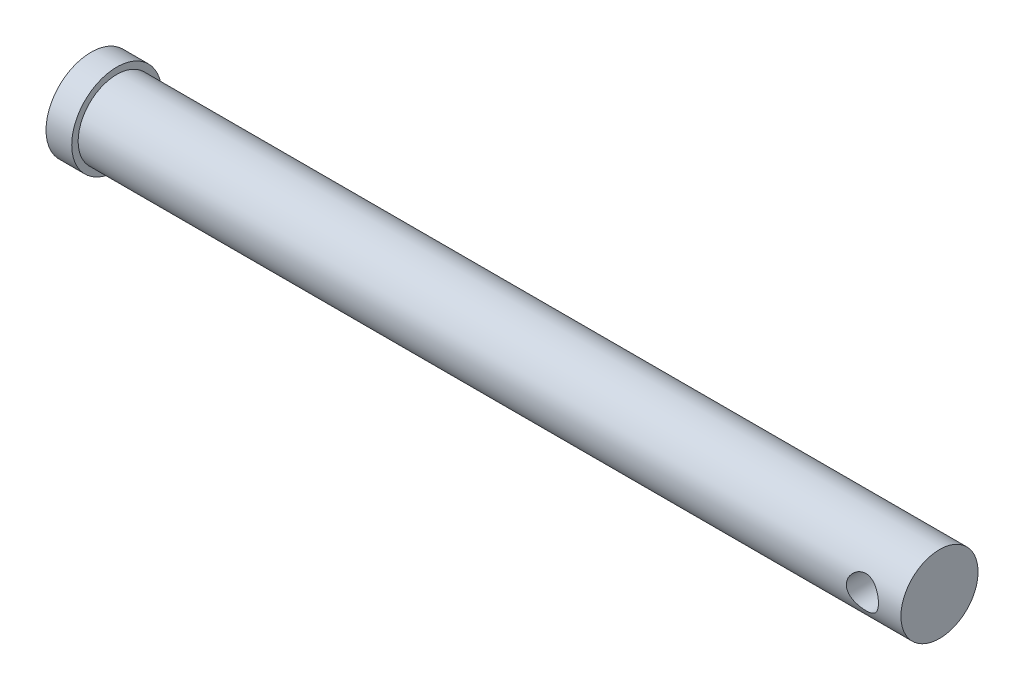
ISO-10303-21;
HEADER;
FILE_DESCRIPTION(('STEP AP214'),'2;1');
FILE_NAME('part.step','',(''),(''),'','','');
FILE_SCHEMA(('AUTOMOTIVE_DESIGN { 1 0 10303 214 1 1 1 1 }'));
ENDSEC;
DATA;
#1=APPLICATION_CONTEXT('core data for automotive mechanical design processes');
#2=APPLICATION_PROTOCOL_DEFINITION('international standard','automotive_design',2000,#1);
#3=PRODUCT_CONTEXT('',#1,'mechanical');
#4=PRODUCT('Part','Part','',(#3));
#5=PRODUCT_RELATED_PRODUCT_CATEGORY('part','',(#4));
#6=PRODUCT_DEFINITION_FORMATION('','',#4);
#7=PRODUCT_DEFINITION_CONTEXT('part definition',#1,'design');
#8=PRODUCT_DEFINITION('design','',#6,#7);
#9=PRODUCT_DEFINITION_SHAPE('','',#8);
#10=(LENGTH_UNIT() NAMED_UNIT(*) SI_UNIT(.MILLI.,.METRE.));
#11=(NAMED_UNIT(*) PLANE_ANGLE_UNIT() SI_UNIT($,.RADIAN.));
#12=(NAMED_UNIT(*) SI_UNIT($,.STERADIAN.) SOLID_ANGLE_UNIT());
#13=UNCERTAINTY_MEASURE_WITH_UNIT(LENGTH_MEASURE(1.E-05),#10,'distance_accuracy_value','');
#14=(GEOMETRIC_REPRESENTATION_CONTEXT(3) GLOBAL_UNCERTAINTY_ASSIGNED_CONTEXT((#13)) GLOBAL_UNIT_ASSIGNED_CONTEXT((#10,
#11,#12)) REPRESENTATION_CONTEXT('',''));
#15=CARTESIAN_POINT('',(0.,0.,0.));
#16=DIRECTION('',(0.,0.,1.));
#17=DIRECTION('',(1.,0.,0.));
#18=AXIS2_PLACEMENT_3D('',#15,#16,#17);
#19=CARTESIAN_POINT('',(0.,0.,0.));
#20=DIRECTION('',(1.,0.,0.));
#21=DIRECTION('',(0.,0.,-1.));
#22=AXIS2_PLACEMENT_3D('',#19,#20,#21);
#23=PLANE('',#22);
#24=CARTESIAN_POINT('',(0.,0.,0.));
#25=DIRECTION('',(-1.,0.,0.));
#26=DIRECTION('',(0.,0.,1.));
#27=AXIS2_PLACEMENT_3D('',#24,#25,#26);
#28=CIRCLE('',#27,35.);
#29=CARTESIAN_POINT('',(0.,0.,35.));
#30=VERTEX_POINT('',#29);
#31=EDGE_CURVE('E45',#30,#30,#28,.T.);
#32=ORIENTED_EDGE('',*,*,#31,.T.);
#33=EDGE_LOOP('',(#32));
#34=FACE_BOUND('',#33,.T.);
#35=ADVANCED_FACE('F30',(#34),#23,.F.);
#36=CARTESIAN_POINT('',(0.,0.,0.));
#37=DIRECTION('',(-1.,0.,0.));
#38=DIRECTION('',(0.,0.,1.));
#39=AXIS2_PLACEMENT_3D('',#36,#37,#38);
#40=CYLINDRICAL_SURFACE('',#39,35.);
#41=ORIENTED_EDGE('',*,*,#31,.F.);
#42=EDGE_LOOP('',(#41));
#43=FACE_BOUND('',#42,.T.);
#44=CARTESIAN_POINT('',(20.,0.,0.));
#45=DIRECTION('',(-1.,0.,0.));
#46=DIRECTION('',(0.,0.,1.));
#47=AXIS2_PLACEMENT_3D('',#44,#45,#46);
#48=CIRCLE('',#47,35.);
#49=CARTESIAN_POINT('',(20.,0.,35.));
#50=VERTEX_POINT('',#49);
#51=EDGE_CURVE('E49',#50,#50,#48,.T.);
#52=ORIENTED_EDGE('',*,*,#51,.T.);
#53=EDGE_LOOP('',(#52));
#54=FACE_BOUND('',#53,.T.);
#55=ADVANCED_FACE('F73',(#43,#54),#40,.T.);
#56=CARTESIAN_POINT('',(20.,35.,0.));
#57=DIRECTION('',(-1.,0.,0.));
#58=DIRECTION('',(0.,0.,1.));
#59=AXIS2_PLACEMENT_3D('',#56,#57,#58);
#60=PLANE('',#59);
#61=ORIENTED_EDGE('',*,*,#51,.F.);
#62=EDGE_LOOP('',(#61));
#63=FACE_BOUND('',#62,.T.);
#64=CARTESIAN_POINT('',(20.,0.,0.));
#65=DIRECTION('',(-1.,0.,0.));
#66=DIRECTION('',(0.,0.,1.));
#67=AXIS2_PLACEMENT_3D('',#64,#65,#66);
#68=CIRCLE('',#67,30.);
#69=CARTESIAN_POINT('',(20.,0.,30.));
#70=VERTEX_POINT('',#69);
#71=EDGE_CURVE('E84',#70,#70,#68,.T.);
#72=ORIENTED_EDGE('',*,*,#71,.T.);
#73=EDGE_LOOP('',(#72));
#74=FACE_BOUND('',#73,.T.);
#75=ADVANCED_FACE('F70',(#63,#74),#60,.F.);
#76=CARTESIAN_POINT('',(0.,0.,0.));
#77=DIRECTION('',(-1.,0.,0.));
#78=DIRECTION('',(0.,0.,1.));
#79=AXIS2_PLACEMENT_3D('',#76,#77,#78);
#80=CYLINDRICAL_SURFACE('',#79,30.);
#81=CARTESIAN_POINT('',(642.5,0.,-30.));
#82=CARTESIAN_POINT('',(642.499997737463,0.334927994932208,-29.9999981863379));
#83=CARTESIAN_POINT('',(642.486520547119,0.669969232648382,-29.9943758255619));
#84=CARTESIAN_POINT('',(642.432737058046,1.3376663217618,-29.9720264311442));
#85=CARTESIAN_POINT('',(642.392413782022,1.67032052897587,-29.9552923705516));
#86=CARTESIAN_POINT('',(642.285230379175,2.33141399499286,-29.9111099060212));
#87=CARTESIAN_POINT('',(642.218308414775,2.6598415776278,-29.8836365374318));
#88=CARTESIAN_POINT('',(642.058628095765,3.30927507907355,-29.8187055132332));
#89=CARTESIAN_POINT('',(641.965873730919,3.63028213568517,-29.7812493994779));
#90=CARTESIAN_POINT('',(641.755770428829,4.26171378384261,-29.6974560461877));
#91=CARTESIAN_POINT('',(641.638505615423,4.57217045496482,-29.6511492290573));
#92=CARTESIAN_POINT('',(641.380215488736,5.18172511192213,-29.5507216980671));
#93=CARTESIAN_POINT('',(641.239189328861,5.48082269257814,-29.4966007058055));
#94=CARTESIAN_POINT('',(640.934584193999,6.06576848350058,-29.3818863014867));
#95=CARTESIAN_POINT('',(640.771018271506,6.35162423485404,-29.3212966398963));
#96=CARTESIAN_POINT('',(640.422368256448,6.90885718553436,-29.195022729357));
#97=CARTESIAN_POINT('',(640.23727575974,7.18022866936116,-29.1293364940195));
#98=CARTESIAN_POINT('',(639.837916141174,7.71899587948688,-28.9913419319896));
#99=CARTESIAN_POINT('',(639.622705196313,7.9856499118296,-28.9188683098638));
#100=CARTESIAN_POINT('',(639.171352578272,8.50020440019901,-28.7718294466365));
#101=CARTESIAN_POINT('',(638.935201386594,8.74809623189095,-28.6972632649868));
#102=CARTESIAN_POINT('',(638.443327589957,9.22373535615688,-28.5479397601468));
#103=CARTESIAN_POINT('',(638.187599226828,9.4514766791381,-28.47318238702));
#104=CARTESIAN_POINT('',(637.658016151244,9.88544327441749,-28.3254401906066));
#105=CARTESIAN_POINT('',(637.384161433083,10.0916685399431,-28.2524553678779));
#106=CARTESIAN_POINT('',(636.805765773519,10.4910002244581,-28.1066952051667));
#107=CARTESIAN_POINT('',(636.500376661366,10.682949927814,-28.034109515646));
#108=CARTESIAN_POINT('',(635.873164765203,11.0402052894183,-27.8953507661184));
#109=CARTESIAN_POINT('',(635.551348856463,11.2055219761728,-27.8291750563435));
#110=CARTESIAN_POINT('',(634.893262474259,11.5081323789493,-27.7054079170409));
#111=CARTESIAN_POINT('',(634.556994563246,11.6454310381676,-27.6478149737476));
#112=CARTESIAN_POINT('',(633.872308543203,11.8906444448827,-27.5432454514779));
#113=CARTESIAN_POINT('',(633.523891341052,11.9985613802922,-27.4962680820561));
#114=CARTESIAN_POINT('',(632.834593085062,12.1793207471183,-27.4166633546951));
#115=CARTESIAN_POINT('',(632.494156434119,12.2536013349868,-27.3834541497239));
#116=CARTESIAN_POINT('',(631.807301165908,12.373567859146,-27.3294560040354));
#117=CARTESIAN_POINT('',(631.460882733877,12.4192546792687,-27.3086666794209));
#118=CARTESIAN_POINT('',(630.765060373939,12.4814516823245,-27.280295782674));
#119=CARTESIAN_POINT('',(630.415657938817,12.4979756832132,-27.2727079554193));
#120=CARTESIAN_POINT('',(629.716674133881,12.5016740788189,-27.2710131480271));
#121=CARTESIAN_POINT('',(629.367092774454,12.4888500184515,-27.2769054582796));
#122=CARTESIAN_POINT('',(628.697474862322,12.4361337502148,-27.3009764660622));
#123=CARTESIAN_POINT('',(628.377230616738,12.3983953341264,-27.3181771243077));
#124=CARTESIAN_POINT('',(627.741370604302,12.298461622168,-27.3633120332247));
#125=CARTESIAN_POINT('',(627.425754564896,12.2362677725175,-27.3912456491796));
#126=CARTESIAN_POINT('',(626.801189833669,12.0880375418719,-27.4569828634023));
#127=CARTESIAN_POINT('',(626.492242073458,12.0019978523769,-27.4947878312322));
#128=CARTESIAN_POINT('',(625.882942707825,11.8068700938581,-27.5791425453202));
#129=CARTESIAN_POINT('',(625.582591439379,11.6977811227264,-27.6256926338389));
#130=CARTESIAN_POINT('',(624.985969877412,11.4549295064097,-27.7272837772485));
#131=CARTESIAN_POINT('',(624.689918322898,11.3206961205365,-27.7824828421147));
#132=CARTESIAN_POINT('',(624.110032645962,11.0301182208009,-27.8991218247836));
#133=CARTESIAN_POINT('',(623.826203021327,10.8737656560619,-27.9605640126362));
#134=CARTESIAN_POINT('',(623.272247093762,10.5400152004209,-28.0880754840439));
#135=CARTESIAN_POINT('',(623.002122628292,10.3626144981682,-28.154145385228));
#136=CARTESIAN_POINT('',(622.476889090412,9.98783756894421,-28.2892696484907));
#137=CARTESIAN_POINT('',(622.221780861733,9.79046022121621,-28.3583241778923));
#138=CARTESIAN_POINT('',(621.70681968636,9.35923598275728,-28.5036972007672));
#139=CARTESIAN_POINT('',(621.448399332536,9.12371578811778,-28.5801350523775));
#140=CARTESIAN_POINT('',(620.952213611763,8.63189108061382,-28.732502513339));
#141=CARTESIAN_POINT('',(620.714440256,8.37559468144405,-28.808432308679));
#142=CARTESIAN_POINT('',(620.260715020453,7.84338442604762,-28.9578616416852));
#143=CARTESIAN_POINT('',(620.044777692751,7.56745769358976,-29.0313595370095));
#144=CARTESIAN_POINT('',(619.636430083219,6.99779831442448,-29.1739092747113));
#145=CARTESIAN_POINT('',(619.444010250777,6.70407296882768,-29.2429629165002));
#146=CARTESIAN_POINT('',(619.079814610659,6.09334741003028,-29.376369071546));
#147=CARTESIAN_POINT('',(618.908626938747,5.7759634922816,-29.440573846529));
#148=CARTESIAN_POINT('',(618.593790611006,5.12627407135823,-29.5606228879899));
#149=CARTESIAN_POINT('',(618.450142660628,4.79396818621533,-29.6164669402937));
#150=CARTESIAN_POINT('',(618.191866254107,4.11693819449464,-29.7181414069687));
#151=CARTESIAN_POINT('',(618.077224853127,3.7722197060632,-29.7639762869078));
#152=CARTESIAN_POINT('',(617.878138064382,3.0728827457243,-29.8442829766498));
#153=CARTESIAN_POINT('',(617.793690382984,2.71826502800773,-29.8787556495544));
#154=CARTESIAN_POINT('',(617.660340350591,2.02472167915904,-29.9334888307974));
#155=CARTESIAN_POINT('',(617.609527311777,1.68622252700082,-29.9545104609511));
#156=CARTESIAN_POINT('',(617.535822565557,1.00568521310793,-29.9850727267961));
#157=CARTESIAN_POINT('',(617.5129296828,0.663647200959429,-29.9946138457802));
#158=CARTESIAN_POINT('',(617.495326640271,-0.0211925398223687,-30.0019464890808));
#159=CARTESIAN_POINT('',(617.500609483263,-0.363994057708202,-29.9997409305985));
#160=CARTESIAN_POINT('',(617.539281441322,-1.04772650377587,-29.9836488123688));
#161=CARTESIAN_POINT('',(617.572669931356,-1.38865747338649,-29.9697625123854));
#162=CARTESIAN_POINT('',(617.664820748045,-2.04913531292545,-29.9316720417125));
#163=CARTESIAN_POINT('',(617.722239012451,-2.36890262006837,-29.9080151775348));
#164=CARTESIAN_POINT('',(617.861545800452,-3.00217138218622,-29.8510976343417));
#165=CARTESIAN_POINT('',(617.943433309115,-3.31567309646927,-29.8178373536574));
#166=CARTESIAN_POINT('',(618.130931470977,-3.93442892579771,-29.7425187627269));
#167=CARTESIAN_POINT('',(618.23654389097,-4.23968242470105,-29.7004597972588));
#168=CARTESIAN_POINT('',(618.470589745042,-4.84009601698797,-29.6085414036647));
#169=CARTESIAN_POINT('',(618.599024011393,-5.13525574180132,-29.5586816910673));
#170=CARTESIAN_POINT('',(618.882014338219,-5.72275808822502,-29.4506702637184));
#171=CARTESIAN_POINT('',(619.037253899632,-6.01473303373731,-29.3923102284589));
#172=CARTESIAN_POINT('',(619.369822963397,-6.58469831942989,-29.2698950625285));
#173=CARTESIAN_POINT('',(619.547160623525,-6.86268344161827,-29.2058378311827));
#174=CARTESIAN_POINT('',(619.922729027603,-7.4031698125695,-29.0735361440343));
#175=CARTESIAN_POINT('',(620.120963222413,-7.66566849269733,-29.0052909974178));
#176=CARTESIAN_POINT('',(620.537115162366,-8.17384122925579,-28.8662039873547));
#177=CARTESIAN_POINT('',(620.755033862874,-8.41951446806475,-28.7953619979726));
#178=CARTESIAN_POINT('',(621.225678730522,-8.90982003974635,-28.6476051949253));
#179=CARTESIAN_POINT('',(621.479780523929,-9.15311243657114,-28.5706194126123));
#180=CARTESIAN_POINT('',(622.007635168143,-9.61746452549377,-28.417672722775));
#181=CARTESIAN_POINT('',(622.281380007775,-9.83853319393545,-28.3417114122797));
#182=CARTESIAN_POINT('',(622.847282547542,-10.2573201759335,-28.1928503849844));
#183=CARTESIAN_POINT('',(623.139452691821,-10.4550224435011,-28.1199527939612));
#184=CARTESIAN_POINT('',(623.74026441151,-10.8254422304116,-27.9794395669387));
#185=CARTESIAN_POINT('',(624.048898907873,-10.9981703710295,-27.9118216911845));
#186=CARTESIAN_POINT('',(624.685545114963,-11.3196985847762,-27.7829961300017));
#187=CARTESIAN_POINT('',(625.013773581412,-11.4681135029757,-27.7218961534604));
#188=CARTESIAN_POINT('',(625.683278249683,-11.736523002824,-27.6093323223056));
#189=CARTESIAN_POINT('',(626.024554681315,-11.856517083637,-27.5578686375075));
#190=CARTESIAN_POINT('',(626.71742501551,-12.0667172577634,-27.4664792334346));
#191=CARTESIAN_POINT('',(627.069011633236,-12.1569438567215,-27.4265455739574));
#192=CARTESIAN_POINT('',(627.779886822322,-12.306624012364,-27.3597104318811));
#193=CARTESIAN_POINT('',(628.139174666008,-12.3660804632245,-27.3328077236331));
#194=CARTESIAN_POINT('',(628.834465655216,-12.4500822188765,-27.2946403841521));
#195=CARTESIAN_POINT('',(629.170130974061,-12.4769635911307,-27.2823309367827));
#196=CARTESIAN_POINT('',(629.842754877434,-12.5035409205824,-27.2701611634868));
#197=CARTESIAN_POINT('',(630.179713391746,-12.503238333444,-27.2703001709624));
#198=CARTESIAN_POINT('',(630.852218382151,-12.4754549232855,-27.2830212970115));
#199=CARTESIAN_POINT('',(631.187765047882,-12.4479778754445,-27.2956016871808));
#200=CARTESIAN_POINT('',(631.854889890761,-12.3661763701555,-27.332758613081));
#201=CARTESIAN_POINT('',(632.186468099777,-12.3118521284453,-27.3573350524144));
#202=CARTESIAN_POINT('',(632.827796660693,-12.1801341867726,-27.4162226268397));
#203=CARTESIAN_POINT('',(633.137841829409,-12.1039406192846,-27.4500237092175));
#204=CARTESIAN_POINT('',(633.750261269465,-11.928413316876,-27.52675288147));
#205=CARTESIAN_POINT('',(634.052632853097,-11.8290715949442,-27.5696841211557));
#206=CARTESIAN_POINT('',(634.647847741204,-11.6081133348142,-27.6634432815302));
#207=CARTESIAN_POINT('',(634.940691015269,-11.4864967255343,-27.7142712274183));
#208=CARTESIAN_POINT('',(635.515322672822,-11.221910919136,-27.8224573605581));
#209=CARTESIAN_POINT('',(635.797110246579,-11.0789401616917,-27.87981602493));
#210=CARTESIAN_POINT('',(636.364817377631,-10.7634011794002,-28.0032066325409));
#211=CARTESIAN_POINT('',(636.649967230142,-10.5895704678187,-28.0695526727734));
#212=CARTESIAN_POINT('',(637.204818163051,-10.2201609506619,-28.2061532605334));
#213=CARTESIAN_POINT('',(637.474518777164,-10.0245814891967,-28.2764079259039));
#214=CARTESIAN_POINT('',(637.997187342919,-9.61278874563058,-28.4190388953867));
#215=CARTESIAN_POINT('',(638.250151250183,-9.39657050683836,-28.4914157062559));
#216=CARTESIAN_POINT('',(638.738026016683,-8.94468989568901,-28.6364948703453));
#217=CARTESIAN_POINT('',(638.972934463185,-8.70902493338051,-28.709197265704));
#218=CARTESIAN_POINT('',(639.439898712192,-8.20156831059379,-28.8584340967181));
#219=CARTESIAN_POINT('',(639.670490802908,-7.92839509352931,-28.9348601750887));
#220=CARTESIAN_POINT('',(640.10779788027,-7.36275583701683,-29.0839359451313));
#221=CARTESIAN_POINT('',(640.314521341694,-7.07029670351858,-29.1565869721));
#222=CARTESIAN_POINT('',(640.702804319402,-6.46750304796756,-29.2961972054604));
#223=CARTESIAN_POINT('',(640.884345133991,-6.15715548075886,-29.3631521675955));
#224=CARTESIAN_POINT('',(641.220549439504,-5.52075682828585,-29.4894294589356));
#225=CARTESIAN_POINT('',(641.375215128642,-5.19470703015242,-29.5487524122869));
#226=CARTESIAN_POINT('',(641.653907845754,-4.53460593286069,-29.6571636819071));
#227=CARTESIAN_POINT('',(641.77839894326,-4.2007758955577,-29.706404926253));
#228=CARTESIAN_POINT('',(641.998753478788,-3.52237260063071,-29.7944604228944));
#229=CARTESIAN_POINT('',(642.094612132753,-3.17779755828613,-29.8332729325945));
#230=CARTESIAN_POINT('',(642.256381307626,-2.48162991640165,-29.8992214193007));
#231=CARTESIAN_POINT('',(642.322375219485,-2.13005975505016,-29.9263898984055));
#232=CARTESIAN_POINT('',(642.423994773255,-1.42200617365138,-29.9683747129706));
#233=CARTESIAN_POINT('',(642.459642706831,-1.06552655596705,-29.9832001152794));
#234=CARTESIAN_POINT('',(642.486614427741,-0.590277288573023,-29.9944248987435));
#235=CARTESIAN_POINT('',(642.491632656972,-0.472292021820432,-29.9965144326355));
#236=CARTESIAN_POINT('',(642.498325846828,-0.236209197902507,-29.9993023050477));
#237=CARTESIAN_POINT('',(642.500000797879,-0.118111640416587,-30.000000639584));
#238=CARTESIAN_POINT('',(642.5,0.,-30.));
#239=B_SPLINE_CURVE_WITH_KNOTS('',3,(#81,#82,#83,#84,#85,#86,#87,#88,#89,#90,#91,#92,#93,#94,
#95,#96,#97,#98,#99,#100,#101,#102,#103,#104,#105,#106,#107,#108,#109,#110,#111,#112,#113,#114,
#115,#116,#117,#118,#119,#120,#121,#122,#123,#124,#125,#126,#127,#128,#129,#130,#131,#132,#133,
#134,#135,#136,#137,#138,#139,#140,#141,#142,#143,#144,#145,#146,#147,#148,#149,#150,#151,#152,
#153,#154,#155,#156,#157,#158,#159,#160,#161,#162,#163,#164,#165,#166,#167,#168,#169,#170,#171,
#172,#173,#174,#175,#176,#177,#178,#179,#180,#181,#182,#183,#184,#185,#186,#187,#188,#189,#190,
#191,#192,#193,#194,#195,#196,#197,#198,#199,#200,#201,#202,#203,#204,#205,#206,#207,#208,#209,
#210,#211,#212,#213,#214,#215,#216,#217,#218,#219,#220,#221,#222,#223,#224,#225,#226,#227,#228,
#229,#230,#231,#232,#233,#234,#235,#236,#237,#238),.UNSPECIFIED.,.T.,.F.,(4,2,2,2,2,2,2,2,2,2,2,
2,2,2,2,2,2,2,2,2,2,2,2,2,2,2,2,2,2,2,2,2,2,2,2,2,2,2,2,2,2,2,2,2,2,2,2,2,2,2,2,2,2,2,2,2,2,2,2,
2,2,2,2,2,2,2,2,2,2,2,2,2,2,2,2,2,2,2,4),(0.,1.00466377798189,2.0099635032318,3.01761418533854,
4.02510932397557,5.02920174469304,6.03332994784093,7.03687909749946,8.04082136416432,
9.09040763162065,10.1404734638639,11.1908493439961,12.2412255547518,13.343658924492,
14.4456346059817,15.5474156984465,16.6491147242287,17.697788537605,18.74642993492,
19.7945743304078,20.8426635516398,21.8102841128417,22.7778474605274,23.7455451204136,
24.7132806612805,25.70137245589,26.6898248231239,27.678409364578,28.6670493997117,
29.7395376959962,30.8116091546477,31.8843904244263,32.9567345726539,34.0541608742379,
35.1516152834557,36.2485790611893,37.3454594916023,38.3729497094308,39.4003966716773,
40.4275884868959,41.4547574593452,42.4308578770207,43.4069178137518,44.3830504617577,
45.3592187148908,46.3654951807192,47.3721442321998,48.3789597832709,49.3858242252431,
50.4649453336415,51.5436288101093,52.6230487797629,53.7020083227624,54.7966829194207,
55.8913768051426,56.9853150171765,58.0791503169505,59.0887421835186,60.098279987847,
61.1076775630545,62.1170670271052,63.0791633380617,64.0415921024074,65.0040239380307,
65.9665261320109,66.9868817454609,68.0072681387289,69.0279002116254,70.0486684342958,
71.1440527390733,72.2390469136821,73.3348499727183,74.4305633598347,75.5081700366371,
76.5859566649337,77.6607149470812,78.7346830461986,79.0889745622273,79.4432670928012),.UNSPECIFIED.);
#240=CARTESIAN_POINT('',(642.5,0.,-30.));
#241=VERTEX_POINT('',#240);
#242=EDGE_CURVE('E10',#241,#241,#239,.T.);
#243=ORIENTED_EDGE('',*,*,#242,.T.);
#244=EDGE_LOOP('',(#243));
#245=FACE_BOUND('',#244,.T.);
#246=CARTESIAN_POINT('',(642.5,0.,30.));
#247=CARTESIAN_POINT('',(642.499997737463,-0.334927994932208,29.9999981863379));
#248=CARTESIAN_POINT('',(642.486520547119,-0.669969232648382,29.9943758255619));
#249=CARTESIAN_POINT('',(642.432737058046,-1.3376663217618,29.9720264311442));
#250=CARTESIAN_POINT('',(642.392413782022,-1.67032052897587,29.9552923705516));
#251=CARTESIAN_POINT('',(642.285230379175,-2.33141399499286,29.9111099060212));
#252=CARTESIAN_POINT('',(642.218308414775,-2.6598415776278,29.8836365374318));
#253=CARTESIAN_POINT('',(642.058628095765,-3.30927507907355,29.8187055132332));
#254=CARTESIAN_POINT('',(641.965873730919,-3.63028213568517,29.7812493994779));
#255=CARTESIAN_POINT('',(641.755770428829,-4.26171378384261,29.6974560461877));
#256=CARTESIAN_POINT('',(641.638505615423,-4.57217045496482,29.6511492290573));
#257=CARTESIAN_POINT('',(641.380215488736,-5.18172511192213,29.5507216980671));
#258=CARTESIAN_POINT('',(641.239189328861,-5.48082269257814,29.4966007058055));
#259=CARTESIAN_POINT('',(640.934584193999,-6.06576848350058,29.3818863014867));
#260=CARTESIAN_POINT('',(640.771018271506,-6.35162423485404,29.3212966398963));
#261=CARTESIAN_POINT('',(640.422368256448,-6.90885718553436,29.195022729357));
#262=CARTESIAN_POINT('',(640.23727575974,-7.18022866936116,29.1293364940195));
#263=CARTESIAN_POINT('',(639.837916141174,-7.71899587948688,28.9913419319896));
#264=CARTESIAN_POINT('',(639.622705196313,-7.9856499118296,28.9188683098638));
#265=CARTESIAN_POINT('',(639.171352578272,-8.50020440019901,28.7718294466365));
#266=CARTESIAN_POINT('',(638.935201386594,-8.74809623189095,28.6972632649868));
#267=CARTESIAN_POINT('',(638.443327589957,-9.22373535615688,28.5479397601468));
#268=CARTESIAN_POINT('',(638.187599226828,-9.4514766791381,28.47318238702));
#269=CARTESIAN_POINT('',(637.658016151244,-9.88544327441749,28.3254401906066));
#270=CARTESIAN_POINT('',(637.384161433083,-10.0916685399431,28.2524553678779));
#271=CARTESIAN_POINT('',(636.805765773519,-10.4910002244581,28.1066952051667));
#272=CARTESIAN_POINT('',(636.500376661366,-10.682949927814,28.034109515646));
#273=CARTESIAN_POINT('',(635.873164765203,-11.0402052894183,27.8953507661184));
#274=CARTESIAN_POINT('',(635.551348856463,-11.2055219761728,27.8291750563435));
#275=CARTESIAN_POINT('',(634.893262474259,-11.5081323789493,27.7054079170409));
#276=CARTESIAN_POINT('',(634.556994563246,-11.6454310381676,27.6478149737476));
#277=CARTESIAN_POINT('',(633.872308543203,-11.8906444448827,27.5432454514779));
#278=CARTESIAN_POINT('',(633.523891341052,-11.9985613802922,27.4962680820561));
#279=CARTESIAN_POINT('',(632.834593085062,-12.1793207471183,27.4166633546951));
#280=CARTESIAN_POINT('',(632.494156434119,-12.2536013349868,27.3834541497239));
#281=CARTESIAN_POINT('',(631.807301165908,-12.373567859146,27.3294560040354));
#282=CARTESIAN_POINT('',(631.460882733877,-12.4192546792687,27.3086666794209));
#283=CARTESIAN_POINT('',(630.765060373939,-12.4814516823245,27.280295782674));
#284=CARTESIAN_POINT('',(630.415657938817,-12.4979756832132,27.2727079554193));
#285=CARTESIAN_POINT('',(629.716674133881,-12.5016740788189,27.2710131480271));
#286=CARTESIAN_POINT('',(629.367092774454,-12.4888500184515,27.2769054582796));
#287=CARTESIAN_POINT('',(628.697474862322,-12.4361337502148,27.3009764660622));
#288=CARTESIAN_POINT('',(628.377230616738,-12.3983953341264,27.3181771243077));
#289=CARTESIAN_POINT('',(627.741370604302,-12.298461622168,27.3633120332247));
#290=CARTESIAN_POINT('',(627.425754564896,-12.2362677725175,27.3912456491796));
#291=CARTESIAN_POINT('',(626.801189833669,-12.0880375418719,27.4569828634023));
#292=CARTESIAN_POINT('',(626.492242073458,-12.0019978523769,27.4947878312322));
#293=CARTESIAN_POINT('',(625.882942707825,-11.8068700938581,27.5791425453202));
#294=CARTESIAN_POINT('',(625.582591439379,-11.6977811227264,27.6256926338389));
#295=CARTESIAN_POINT('',(624.985969877412,-11.4549295064097,27.7272837772485));
#296=CARTESIAN_POINT('',(624.689918322898,-11.3206961205365,27.7824828421147));
#297=CARTESIAN_POINT('',(624.110032645962,-11.0301182208009,27.8991218247836));
#298=CARTESIAN_POINT('',(623.826203021327,-10.8737656560619,27.9605640126362));
#299=CARTESIAN_POINT('',(623.272247093762,-10.5400152004209,28.0880754840439));
#300=CARTESIAN_POINT('',(623.002122628292,-10.3626144981682,28.154145385228));
#301=CARTESIAN_POINT('',(622.476889090412,-9.98783756894421,28.2892696484907));
#302=CARTESIAN_POINT('',(622.221780861733,-9.79046022121621,28.3583241778923));
#303=CARTESIAN_POINT('',(621.70681968636,-9.35923598275728,28.5036972007672));
#304=CARTESIAN_POINT('',(621.448399332536,-9.12371578811778,28.5801350523775));
#305=CARTESIAN_POINT('',(620.952213611763,-8.63189108061382,28.732502513339));
#306=CARTESIAN_POINT('',(620.714440256,-8.37559468144405,28.808432308679));
#307=CARTESIAN_POINT('',(620.260715020453,-7.84338442604762,28.9578616416852));
#308=CARTESIAN_POINT('',(620.044777692751,-7.56745769358976,29.0313595370095));
#309=CARTESIAN_POINT('',(619.636430083219,-6.99779831442448,29.1739092747113));
#310=CARTESIAN_POINT('',(619.444010250777,-6.70407296882768,29.2429629165002));
#311=CARTESIAN_POINT('',(619.079814610659,-6.09334741003028,29.376369071546));
#312=CARTESIAN_POINT('',(618.908626938747,-5.7759634922816,29.440573846529));
#313=CARTESIAN_POINT('',(618.593790611006,-5.12627407135823,29.5606228879899));
#314=CARTESIAN_POINT('',(618.450142660628,-4.79396818621533,29.6164669402937));
#315=CARTESIAN_POINT('',(618.191866254107,-4.11693819449464,29.7181414069687));
#316=CARTESIAN_POINT('',(618.077224853127,-3.7722197060632,29.7639762869078));
#317=CARTESIAN_POINT('',(617.878138064382,-3.0728827457243,29.8442829766498));
#318=CARTESIAN_POINT('',(617.793690382984,-2.71826502800773,29.8787556495544));
#319=CARTESIAN_POINT('',(617.660340350591,-2.02472167915904,29.9334888307974));
#320=CARTESIAN_POINT('',(617.609527311777,-1.68622252700082,29.9545104609511));
#321=CARTESIAN_POINT('',(617.535822565557,-1.00568521310793,29.9850727267961));
#322=CARTESIAN_POINT('',(617.5129296828,-0.663647200959429,29.9946138457802));
#323=CARTESIAN_POINT('',(617.495326640271,0.0211925398223687,30.0019464890808));
#324=CARTESIAN_POINT('',(617.500609483263,0.363994057708202,29.9997409305985));
#325=CARTESIAN_POINT('',(617.539281441322,1.04772650377587,29.9836488123688));
#326=CARTESIAN_POINT('',(617.572669931356,1.38865747338649,29.9697625123854));
#327=CARTESIAN_POINT('',(617.664820748045,2.04913531292545,29.9316720417125));
#328=CARTESIAN_POINT('',(617.722239012451,2.36890262006837,29.9080151775348));
#329=CARTESIAN_POINT('',(617.861545800452,3.00217138218622,29.8510976343417));
#330=CARTESIAN_POINT('',(617.943433309115,3.31567309646927,29.8178373536574));
#331=CARTESIAN_POINT('',(618.130931470977,3.93442892579771,29.7425187627269));
#332=CARTESIAN_POINT('',(618.23654389097,4.23968242470105,29.7004597972588));
#333=CARTESIAN_POINT('',(618.470589745042,4.84009601698797,29.6085414036647));
#334=CARTESIAN_POINT('',(618.599024011393,5.13525574180132,29.5586816910673));
#335=CARTESIAN_POINT('',(618.882014338219,5.72275808822502,29.4506702637184));
#336=CARTESIAN_POINT('',(619.037253899632,6.01473303373731,29.3923102284589));
#337=CARTESIAN_POINT('',(619.369822963397,6.58469831942989,29.2698950625285));
#338=CARTESIAN_POINT('',(619.547160623525,6.86268344161827,29.2058378311827));
#339=CARTESIAN_POINT('',(619.922729027603,7.4031698125695,29.0735361440343));
#340=CARTESIAN_POINT('',(620.120963222413,7.66566849269733,29.0052909974178));
#341=CARTESIAN_POINT('',(620.537115162366,8.17384122925579,28.8662039873547));
#342=CARTESIAN_POINT('',(620.755033862874,8.41951446806475,28.7953619979726));
#343=CARTESIAN_POINT('',(621.225678730522,8.90982003974635,28.6476051949253));
#344=CARTESIAN_POINT('',(621.479780523929,9.15311243657114,28.5706194126123));
#345=CARTESIAN_POINT('',(622.007635168143,9.61746452549377,28.417672722775));
#346=CARTESIAN_POINT('',(622.281380007775,9.83853319393545,28.3417114122797));
#347=CARTESIAN_POINT('',(622.847282547542,10.2573201759335,28.1928503849844));
#348=CARTESIAN_POINT('',(623.139452691821,10.4550224435011,28.1199527939612));
#349=CARTESIAN_POINT('',(623.74026441151,10.8254422304116,27.9794395669387));
#350=CARTESIAN_POINT('',(624.048898907873,10.9981703710295,27.9118216911845));
#351=CARTESIAN_POINT('',(624.685545114963,11.3196985847762,27.7829961300017));
#352=CARTESIAN_POINT('',(625.013773581412,11.4681135029757,27.7218961534604));
#353=CARTESIAN_POINT('',(625.683278249683,11.736523002824,27.6093323223056));
#354=CARTESIAN_POINT('',(626.024554681315,11.856517083637,27.5578686375075));
#355=CARTESIAN_POINT('',(626.71742501551,12.0667172577634,27.4664792334346));
#356=CARTESIAN_POINT('',(627.069011633236,12.1569438567215,27.4265455739574));
#357=CARTESIAN_POINT('',(627.779886822322,12.306624012364,27.3597104318811));
#358=CARTESIAN_POINT('',(628.139174666008,12.3660804632245,27.3328077236331));
#359=CARTESIAN_POINT('',(628.834465655216,12.4500822188765,27.2946403841521));
#360=CARTESIAN_POINT('',(629.170130974061,12.4769635911307,27.2823309367827));
#361=CARTESIAN_POINT('',(629.842754877434,12.5035409205824,27.2701611634868));
#362=CARTESIAN_POINT('',(630.179713391746,12.503238333444,27.2703001709624));
#363=CARTESIAN_POINT('',(630.852218382151,12.4754549232855,27.2830212970115));
#364=CARTESIAN_POINT('',(631.187765047882,12.4479778754445,27.2956016871808));
#365=CARTESIAN_POINT('',(631.854889890761,12.3661763701555,27.332758613081));
#366=CARTESIAN_POINT('',(632.186468099777,12.3118521284453,27.3573350524144));
#367=CARTESIAN_POINT('',(632.827796660693,12.1801341867726,27.4162226268397));
#368=CARTESIAN_POINT('',(633.137841829409,12.1039406192846,27.4500237092175));
#369=CARTESIAN_POINT('',(633.750261269465,11.928413316876,27.52675288147));
#370=CARTESIAN_POINT('',(634.052632853097,11.8290715949442,27.5696841211557));
#371=CARTESIAN_POINT('',(634.647847741204,11.6081133348142,27.6634432815302));
#372=CARTESIAN_POINT('',(634.940691015269,11.4864967255343,27.7142712274183));
#373=CARTESIAN_POINT('',(635.515322672822,11.221910919136,27.8224573605581));
#374=CARTESIAN_POINT('',(635.797110246579,11.0789401616917,27.87981602493));
#375=CARTESIAN_POINT('',(636.364817377631,10.7634011794002,28.0032066325409));
#376=CARTESIAN_POINT('',(636.649967230142,10.5895704678187,28.0695526727734));
#377=CARTESIAN_POINT('',(637.204818163051,10.2201609506619,28.2061532605334));
#378=CARTESIAN_POINT('',(637.474518777164,10.0245814891967,28.2764079259039));
#379=CARTESIAN_POINT('',(637.997187342919,9.61278874563058,28.4190388953867));
#380=CARTESIAN_POINT('',(638.250151250183,9.39657050683836,28.4914157062559));
#381=CARTESIAN_POINT('',(638.738026016683,8.94468989568901,28.6364948703453));
#382=CARTESIAN_POINT('',(638.972934463185,8.70902493338051,28.709197265704));
#383=CARTESIAN_POINT('',(639.439898712192,8.20156831059379,28.8584340967181));
#384=CARTESIAN_POINT('',(639.670490802908,7.92839509352931,28.9348601750887));
#385=CARTESIAN_POINT('',(640.10779788027,7.36275583701683,29.0839359451313));
#386=CARTESIAN_POINT('',(640.314521341694,7.07029670351858,29.1565869721));
#387=CARTESIAN_POINT('',(640.702804319402,6.46750304796756,29.2961972054604));
#388=CARTESIAN_POINT('',(640.884345133991,6.15715548075886,29.3631521675955));
#389=CARTESIAN_POINT('',(641.220549439504,5.52075682828585,29.4894294589356));
#390=CARTESIAN_POINT('',(641.375215128642,5.19470703015242,29.5487524122869));
#391=CARTESIAN_POINT('',(641.653907845754,4.53460593286069,29.6571636819071));
#392=CARTESIAN_POINT('',(641.77839894326,4.2007758955577,29.706404926253));
#393=CARTESIAN_POINT('',(641.998753478788,3.52237260063071,29.7944604228944));
#394=CARTESIAN_POINT('',(642.094612132753,3.17779755828613,29.8332729325945));
#395=CARTESIAN_POINT('',(642.256381307626,2.48162991640165,29.8992214193007));
#396=CARTESIAN_POINT('',(642.322375219485,2.13005975505016,29.9263898984055));
#397=CARTESIAN_POINT('',(642.423994773255,1.42200617365138,29.9683747129706));
#398=CARTESIAN_POINT('',(642.459642706831,1.06552655596705,29.9832001152794));
#399=CARTESIAN_POINT('',(642.486614427741,0.590277288573023,29.9944248987435));
#400=CARTESIAN_POINT('',(642.491632656972,0.472292021820432,29.9965144326355));
#401=CARTESIAN_POINT('',(642.498325846828,0.236209197902507,29.9993023050477));
#402=CARTESIAN_POINT('',(642.500000797879,0.118111640416587,30.000000639584));
#403=CARTESIAN_POINT('',(642.5,0.,30.));
#404=B_SPLINE_CURVE_WITH_KNOTS('',3,(#246,#247,#248,#249,#250,#251,#252,#253,#254,#255,#256,
#257,#258,#259,#260,#261,#262,#263,#264,#265,#266,#267,#268,#269,#270,#271,#272,#273,#274,#275,
#276,#277,#278,#279,#280,#281,#282,#283,#284,#285,#286,#287,#288,#289,#290,#291,#292,#293,#294,
#295,#296,#297,#298,#299,#300,#301,#302,#303,#304,#305,#306,#307,#308,#309,#310,#311,#312,#313,
#314,#315,#316,#317,#318,#319,#320,#321,#322,#323,#324,#325,#326,#327,#328,#329,#330,#331,#332,
#333,#334,#335,#336,#337,#338,#339,#340,#341,#342,#343,#344,#345,#346,#347,#348,#349,#350,#351,
#352,#353,#354,#355,#356,#357,#358,#359,#360,#361,#362,#363,#364,#365,#366,#367,#368,#369,#370,
#371,#372,#373,#374,#375,#376,#377,#378,#379,#380,#381,#382,#383,#384,#385,#386,#387,#388,#389,
#390,#391,#392,#393,#394,#395,#396,#397,#398,#399,#400,#401,#402,#403),.UNSPECIFIED.,.T.,.F.,(4,
2,2,2,2,2,2,2,2,2,2,2,2,2,2,2,2,2,2,2,2,2,2,2,2,2,2,2,2,2,2,2,2,2,2,2,2,2,2,2,2,2,2,2,2,2,2,2,2,
2,2,2,2,2,2,2,2,2,2,2,2,2,2,2,2,2,2,2,2,2,2,2,2,2,2,2,2,2,4),(0.,1.00466377798189,
2.0099635032318,3.01761418533854,4.02510932397557,5.02920174469304,6.03332994784093,
7.03687909749946,8.04082136416432,9.09040763162065,10.1404734638639,11.1908493439961,
12.2412255547518,13.343658924492,14.4456346059817,15.5474156984465,16.6491147242287,
17.697788537605,18.74642993492,19.7945743304078,20.8426635516398,21.8102841128417,
22.7778474605274,23.7455451204136,24.7132806612805,25.70137245589,26.6898248231239,
27.678409364578,28.6670493997117,29.7395376959962,30.8116091546477,31.8843904244263,
32.9567345726539,34.0541608742379,35.1516152834557,36.2485790611893,37.3454594916023,
38.3729497094308,39.4003966716773,40.4275884868959,41.4547574593452,42.4308578770207,
43.4069178137518,44.3830504617577,45.3592187148908,46.3654951807192,47.3721442321998,
48.3789597832709,49.3858242252431,50.4649453336415,51.5436288101093,52.6230487797629,
53.7020083227624,54.7966829194207,55.8913768051426,56.9853150171765,58.0791503169505,
59.0887421835186,60.098279987847,61.1076775630545,62.1170670271052,63.0791633380617,
64.0415921024074,65.0040239380307,65.9665261320109,66.9868817454609,68.0072681387289,
69.0279002116254,70.0486684342958,71.1440527390733,72.2390469136821,73.3348499727183,
74.4305633598347,75.5081700366371,76.5859566649337,77.6607149470812,78.7346830461986,
79.0889745622273,79.4432670928012),.UNSPECIFIED.);
#405=CARTESIAN_POINT('',(642.5,0.,30.));
#406=VERTEX_POINT('',#405);
#407=EDGE_CURVE('E41',#406,#406,#404,.T.);
#408=ORIENTED_EDGE('',*,*,#407,.T.);
#409=EDGE_LOOP('',(#408));
#410=FACE_BOUND('',#409,.T.);
#411=ORIENTED_EDGE('',*,*,#71,.F.);
#412=EDGE_LOOP('',(#411));
#413=FACE_BOUND('',#412,.T.);
#414=CARTESIAN_POINT('',(660.,0.,0.));
#415=DIRECTION('',(-1.,0.,0.));
#416=DIRECTION('',(0.,0.,1.));
#417=AXIS2_PLACEMENT_3D('',#414,#415,#416);
#418=CIRCLE('',#417,30.);
#419=CARTESIAN_POINT('',(660.,0.,30.));
#420=VERTEX_POINT('',#419);
#421=EDGE_CURVE('E86',#420,#420,#418,.T.);
#422=ORIENTED_EDGE('',*,*,#421,.T.);
#423=EDGE_LOOP('',(#422));
#424=FACE_BOUND('',#423,.T.);
#425=ADVANCED_FACE('F55',(#245,#410,#413,#424),#80,.T.);
#426=CARTESIAN_POINT('',(660.,30.,0.));
#427=DIRECTION('',(-1.,0.,0.));
#428=DIRECTION('',(0.,0.,1.));
#429=AXIS2_PLACEMENT_3D('',#426,#427,#428);
#430=PLANE('',#429);
#431=ORIENTED_EDGE('',*,*,#421,.F.);
#432=EDGE_LOOP('',(#431));
#433=FACE_BOUND('',#432,.T.);
#434=ADVANCED_FACE('F62',(#433),#430,.F.);
#435=CARTESIAN_POINT('',(630.,0.,-30.));
#436=DIRECTION('',(0.,0.,1.));
#437=DIRECTION('',(1.,0.,0.));
#438=AXIS2_PLACEMENT_3D('',#435,#436,#437);
#439=CYLINDRICAL_SURFACE('',#438,12.5);
#440=ORIENTED_EDGE('',*,*,#407,.F.);
#441=EDGE_LOOP('',(#440));
#442=FACE_BOUND('',#441,.T.);
#443=ORIENTED_EDGE('',*,*,#242,.F.);
#444=EDGE_LOOP('',(#443));
#445=FACE_BOUND('',#444,.T.);
#446=ADVANCED_FACE('F59',(#442,#445),#439,.F.);
#447=CLOSED_SHELL('',(#35,#55,#75,#425,#434,#446));
#448=MANIFOLD_SOLID_BREP('B2',#447);
#449=ADVANCED_BREP_SHAPE_REPRESENTATION('',(#18,#448),#14);
#450=SHAPE_DEFINITION_REPRESENTATION(#9,#449);
ENDSEC;
END-ISO-10303-21;
